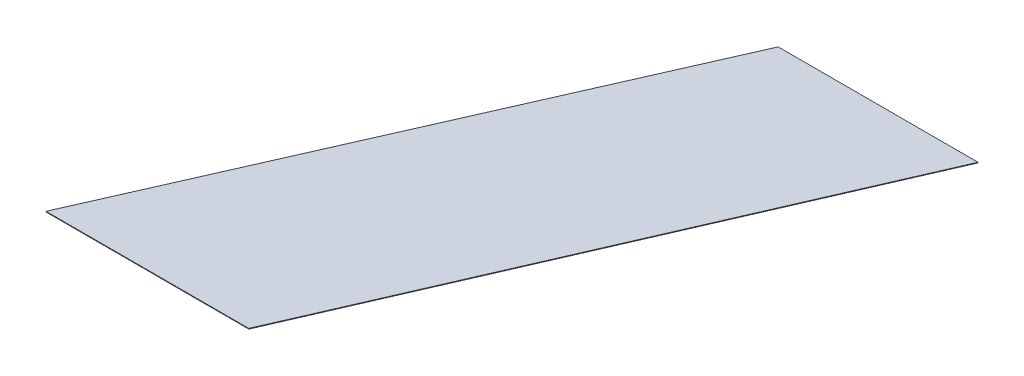
ISO-10303-21;
HEADER;
FILE_DESCRIPTION(('STEP AP214'),'2;1');
FILE_NAME('part.step','',(''),(''),'','','');
FILE_SCHEMA(('AUTOMOTIVE_DESIGN { 1 0 10303 214 1 1 1 1 }'));
ENDSEC;
DATA;
#1=APPLICATION_CONTEXT('core data for automotive mechanical design processes');
#2=APPLICATION_PROTOCOL_DEFINITION('international standard','automotive_design',2000,#1);
#3=PRODUCT_CONTEXT('',#1,'mechanical');
#4=PRODUCT('Part','Part','',(#3));
#5=PRODUCT_RELATED_PRODUCT_CATEGORY('part','',(#4));
#6=PRODUCT_DEFINITION_FORMATION('','',#4);
#7=PRODUCT_DEFINITION_CONTEXT('part definition',#1,'design');
#8=PRODUCT_DEFINITION('design','',#6,#7);
#9=PRODUCT_DEFINITION_SHAPE('','',#8);
#10=(LENGTH_UNIT() NAMED_UNIT(*) SI_UNIT(.MILLI.,.METRE.));
#11=(NAMED_UNIT(*) PLANE_ANGLE_UNIT() SI_UNIT($,.RADIAN.));
#12=(NAMED_UNIT(*) SI_UNIT($,.STERADIAN.) SOLID_ANGLE_UNIT());
#13=UNCERTAINTY_MEASURE_WITH_UNIT(LENGTH_MEASURE(1.E-05),#10,'distance_accuracy_value','');
#14=(GEOMETRIC_REPRESENTATION_CONTEXT(3) GLOBAL_UNCERTAINTY_ASSIGNED_CONTEXT((#13)) GLOBAL_UNIT_ASSIGNED_CONTEXT((#10,
#11,#12)) REPRESENTATION_CONTEXT('',''));
#15=CARTESIAN_POINT('',(0.,0.,0.));
#16=DIRECTION('',(0.,0.,1.));
#17=DIRECTION('',(1.,0.,0.));
#18=AXIS2_PLACEMENT_3D('',#15,#16,#17);
#19=CARTESIAN_POINT('',(0.,1.4,0.));
#20=DIRECTION('',(0.,-1.,0.));
#21=DIRECTION('',(0.,0.,-1.));
#22=AXIS2_PLACEMENT_3D('',#19,#20,#21);
#23=PLANE('',#22);
#24=DIRECTION('',(-0.398135830493947,0.,0.91732647431375));
#25=VECTOR('',#24,1.);
#26=CARTESIAN_POINT('',(3.64028419583885,1.4,-1.15597023844351));
#27=LINE('',#26,#25);
#28=CARTESIAN_POINT('',(3.64028419583885,1.4,-1.15597023844351));
#29=VERTEX_POINT('',#28);
#30=CARTESIAN_POINT('',(3.27510720507906,1.4,-0.314582712436161));
#31=VERTEX_POINT('',#30);
#32=EDGE_CURVE('E59',#29,#31,#27,.T.);
#33=ORIENTED_EDGE('',*,*,#32,.T.);
#34=DIRECTION('',(-1.,0.,0.));
#35=VECTOR('',#34,1.);
#36=CARTESIAN_POINT('',(3.27510720507906,1.4,-0.314582712436161));
#37=LINE('',#36,#35);
#38=CARTESIAN_POINT('',(2.93953915951594,1.4,-0.314582712436161));
#39=VERTEX_POINT('',#38);
#40=EDGE_CURVE('E79',#31,#39,#37,.T.);
#41=ORIENTED_EDGE('',*,*,#40,.T.);
#42=DIRECTION('',(0.402648655070182,0.,-0.91535460919262));
#43=VECTOR('',#42,1.);
#44=CARTESIAN_POINT('',(2.93953915951594,1.4,-0.314582712436161));
#45=LINE('',#44,#43);
#46=CARTESIAN_POINT('',(3.30965097447528,1.4,-1.15597023844351));
#47=VERTEX_POINT('',#46);
#48=EDGE_CURVE('E73',#39,#47,#45,.T.);
#49=ORIENTED_EDGE('',*,*,#48,.T.);
#50=DIRECTION('',(1.,0.,0.));
#51=VECTOR('',#50,1.);
#52=CARTESIAN_POINT('',(3.30965097447528,1.4,-1.15597023844351));
#53=LINE('',#52,#51);
#54=EDGE_CURVE('E62',#47,#29,#53,.T.);
#55=ORIENTED_EDGE('',*,*,#54,.T.);
#56=EDGE_LOOP('',(#33,#41,#49,#55));
#57=FACE_BOUND('',#56,.T.);
#58=ADVANCED_FACE('F16',(#57),#23,.T.);
#59=CARTESIAN_POINT('',(3.30965097447528,1.401,-1.15597023844351));
#60=DIRECTION('',(0.,0.,1.));
#61=DIRECTION('',(1.,0.,0.));
#62=AXIS2_PLACEMENT_3D('',#59,#60,#61);
#63=PLANE('',#62);
#64=DIRECTION('',(0.,1.,0.));
#65=VECTOR('',#64,1.);
#66=CARTESIAN_POINT('',(3.30965097447528,1.401,-1.15597023844351));
#67=LINE('',#66,#65);
#68=CARTESIAN_POINT('',(3.30965097447528,1.401,-1.15597023844351));
#69=VERTEX_POINT('',#68);
#70=EDGE_CURVE('E72',#47,#69,#67,.T.);
#71=ORIENTED_EDGE('',*,*,#70,.T.);
#72=DIRECTION('',(1.,0.,0.));
#73=VECTOR('',#72,1.);
#74=CARTESIAN_POINT('',(0.,1.401,-1.15597023844351));
#75=LINE('',#74,#73);
#76=CARTESIAN_POINT('',(3.64028419583885,1.401,-1.15597023844351));
#77=VERTEX_POINT('',#76);
#78=EDGE_CURVE('E66',#69,#77,#75,.T.);
#79=ORIENTED_EDGE('',*,*,#78,.T.);
#80=DIRECTION('',(0.,1.,0.));
#81=VECTOR('',#80,1.);
#82=CARTESIAN_POINT('',(3.64028419583885,1.401,-1.15597023844351));
#83=LINE('',#82,#81);
#84=EDGE_CURVE('E19',#77,#29,#83,.F.);
#85=ORIENTED_EDGE('',*,*,#84,.T.);
#86=ORIENTED_EDGE('',*,*,#54,.F.);
#87=EDGE_LOOP('',(#71,#79,#85,#86));
#88=FACE_BOUND('',#87,.T.);
#89=ADVANCED_FACE('F70',(#88),#63,.F.);
#90=CARTESIAN_POINT('',(3.64028419583885,1.401,-1.15597023844351));
#91=DIRECTION('',(-0.91732647431375,0.,-0.398135830493947));
#92=DIRECTION('',(-0.398135830493947,0.,0.91732647431375));
#93=AXIS2_PLACEMENT_3D('',#90,#91,#92);
#94=PLANE('',#93);
#95=ORIENTED_EDGE('',*,*,#84,.F.);
#96=DIRECTION('',(-0.398135830493946,0.,0.91732647431375));
#97=VECTOR('',#96,1.);
#98=CARTESIAN_POINT('',(3.64028419583885,1.401,-1.15597023844351));
#99=LINE('',#98,#97);
#100=CARTESIAN_POINT('',(3.27510720507906,1.401,-0.314582712436161));
#101=VERTEX_POINT('',#100);
#102=EDGE_CURVE('E58',#77,#101,#99,.T.);
#103=ORIENTED_EDGE('',*,*,#102,.T.);
#104=DIRECTION('',(0.,1.,0.));
#105=VECTOR('',#104,1.);
#106=CARTESIAN_POINT('',(3.27510720507906,1.401,-0.314582712436161));
#107=LINE('',#106,#105);
#108=EDGE_CURVE('E80',#101,#31,#107,.F.);
#109=ORIENTED_EDGE('',*,*,#108,.T.);
#110=ORIENTED_EDGE('',*,*,#32,.F.);
#111=EDGE_LOOP('',(#95,#103,#109,#110));
#112=FACE_BOUND('',#111,.T.);
#113=ADVANCED_FACE('F56',(#112),#94,.F.);
#114=CARTESIAN_POINT('',(3.27510720507906,1.401,-0.314582712436161));
#115=DIRECTION('',(0.,0.,-1.));
#116=DIRECTION('',(-1.,0.,0.));
#117=AXIS2_PLACEMENT_3D('',#114,#115,#116);
#118=PLANE('',#117);
#119=ORIENTED_EDGE('',*,*,#108,.F.);
#120=DIRECTION('',(1.,0.,0.));
#121=VECTOR('',#120,1.);
#122=CARTESIAN_POINT('',(0.,1.401,-0.314582712436161));
#123=LINE('',#122,#121);
#124=CARTESIAN_POINT('',(2.93953915951594,1.401,-0.314582712436161));
#125=VERTEX_POINT('',#124);
#126=EDGE_CURVE('E25',#101,#125,#123,.F.);
#127=ORIENTED_EDGE('',*,*,#126,.T.);
#128=DIRECTION('',(0.,1.,0.));
#129=VECTOR('',#128,1.);
#130=CARTESIAN_POINT('',(2.93953915951594,1.401,-0.314582712436161));
#131=LINE('',#130,#129);
#132=EDGE_CURVE('E33',#125,#39,#131,.F.);
#133=ORIENTED_EDGE('',*,*,#132,.T.);
#134=ORIENTED_EDGE('',*,*,#40,.F.);
#135=EDGE_LOOP('',(#119,#127,#133,#134));
#136=FACE_BOUND('',#135,.T.);
#137=ADVANCED_FACE('F88',(#136),#118,.F.);
#138=CARTESIAN_POINT('',(2.93953915951594,1.401,-0.314582712436161));
#139=DIRECTION('',(0.91535460919262,0.,0.402648655070182));
#140=DIRECTION('',(0.402648655070182,0.,-0.91535460919262));
#141=AXIS2_PLACEMENT_3D('',#138,#139,#140);
#142=PLANE('',#141);
#143=ORIENTED_EDGE('',*,*,#132,.F.);
#144=DIRECTION('',(0.402648655070173,0.,-0.915354609192624));
#145=VECTOR('',#144,1.);
#146=CARTESIAN_POINT('',(2.93953915951594,1.401,-0.314582712436161));
#147=LINE('',#146,#145);
#148=EDGE_CURVE('E11',#125,#69,#147,.T.);
#149=ORIENTED_EDGE('',*,*,#148,.T.);
#150=ORIENTED_EDGE('',*,*,#70,.F.);
#151=ORIENTED_EDGE('',*,*,#48,.F.);
#152=EDGE_LOOP('',(#143,#149,#150,#151));
#153=FACE_BOUND('',#152,.T.);
#154=ADVANCED_FACE('F90',(#153),#142,.F.);
#155=CARTESIAN_POINT('',(0.,1.401,0.));
#156=DIRECTION('',(0.,-1.,0.));
#157=DIRECTION('',(0.,0.,-1.));
#158=AXIS2_PLACEMENT_3D('',#155,#156,#157);
#159=PLANE('',#158);
#160=ORIENTED_EDGE('',*,*,#126,.F.);
#161=ORIENTED_EDGE('',*,*,#102,.F.);
#162=ORIENTED_EDGE('',*,*,#78,.F.);
#163=ORIENTED_EDGE('',*,*,#148,.F.);
#164=EDGE_LOOP('',(#160,#161,#162,#163));
#165=FACE_BOUND('',#164,.T.);
#166=ADVANCED_FACE('F65',(#165),#159,.F.);
#167=CLOSED_SHELL('',(#58,#89,#113,#137,#154,#166));
#168=MANIFOLD_SOLID_BREP('B1',#167);
#169=ADVANCED_BREP_SHAPE_REPRESENTATION('',(#18,#168),#14);
#170=SHAPE_DEFINITION_REPRESENTATION(#9,#169);
ENDSEC;
END-ISO-10303-21;
